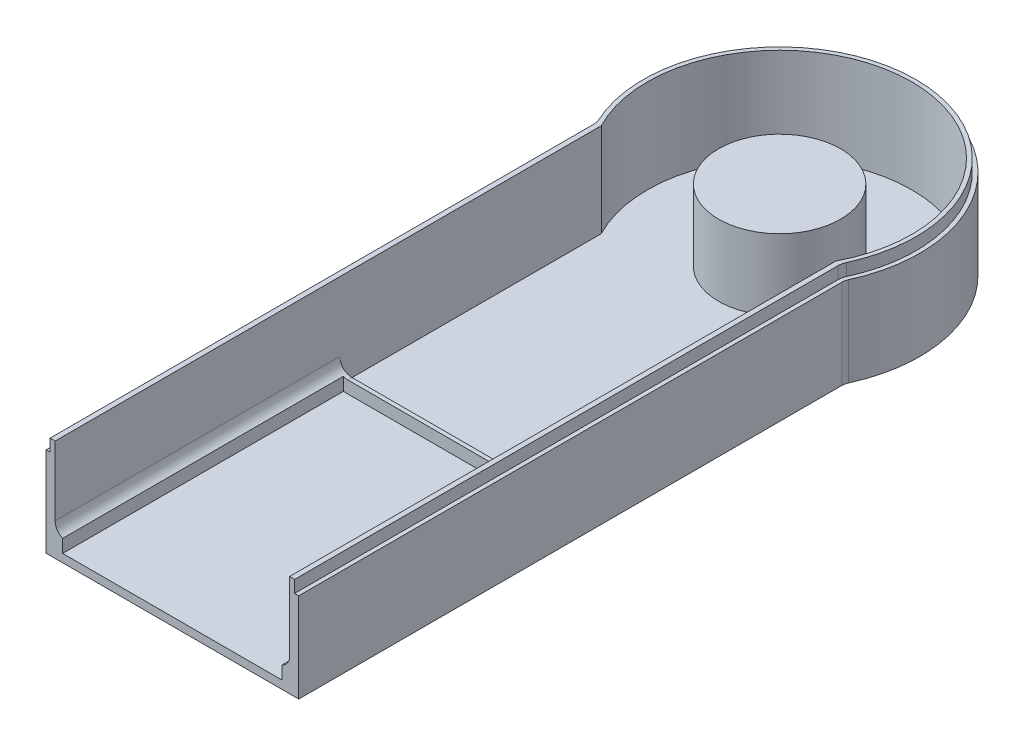
ISO-10303-21;
HEADER;
FILE_DESCRIPTION(('STEP AP214'),'2;1');
FILE_NAME('part.step','',(''),(''),'','','');
FILE_SCHEMA(('AUTOMOTIVE_DESIGN { 1 0 10303 214 1 1 1 1 }'));
ENDSEC;
DATA;
#1=APPLICATION_CONTEXT('core data for automotive mechanical design processes');
#2=APPLICATION_PROTOCOL_DEFINITION('international standard','automotive_design',2000,#1);
#3=PRODUCT_CONTEXT('',#1,'mechanical');
#4=PRODUCT('Part','Part','',(#3));
#5=PRODUCT_RELATED_PRODUCT_CATEGORY('part','',(#4));
#6=PRODUCT_DEFINITION_FORMATION('','',#4);
#7=PRODUCT_DEFINITION_CONTEXT('part definition',#1,'design');
#8=PRODUCT_DEFINITION('design','',#6,#7);
#9=PRODUCT_DEFINITION_SHAPE('','',#8);
#10=(LENGTH_UNIT() NAMED_UNIT(*) SI_UNIT(.MILLI.,.METRE.));
#11=(NAMED_UNIT(*) PLANE_ANGLE_UNIT() SI_UNIT($,.RADIAN.));
#12=(NAMED_UNIT(*) SI_UNIT($,.STERADIAN.) SOLID_ANGLE_UNIT());
#13=UNCERTAINTY_MEASURE_WITH_UNIT(LENGTH_MEASURE(1.E-05),#10,'distance_accuracy_value','');
#14=(GEOMETRIC_REPRESENTATION_CONTEXT(3) GLOBAL_UNCERTAINTY_ASSIGNED_CONTEXT((#13)) GLOBAL_UNIT_ASSIGNED_CONTEXT((#10,
#11,#12)) REPRESENTATION_CONTEXT('',''));
#15=CARTESIAN_POINT('',(0.,0.,0.));
#16=DIRECTION('',(0.,0.,1.));
#17=DIRECTION('',(1.,0.,0.));
#18=AXIS2_PLACEMENT_3D('',#15,#16,#17);
#19=CARTESIAN_POINT('',(0.,0.,0.));
#20=DIRECTION('',(0.,1.,0.));
#21=DIRECTION('',(-1.,0.,0.));
#22=AXIS2_PLACEMENT_3D('',#19,#20,#21);
#23=CYLINDRICAL_SURFACE('',#22,34.5);
#24=DIRECTION('',(0.,1.,0.));
#25=VECTOR('',#24,1.);
#26=CARTESIAN_POINT('',(-31.342994944547,0.,14.4175819021811));
#27=LINE('',#26,#25);
#28=CARTESIAN_POINT('',(-31.342994944547,-47.,14.4175819021811));
#29=VERTEX_POINT('',#28);
#30=CARTESIAN_POINT('',(-31.342994944547,-25.,14.4175819021811));
#31=VERTEX_POINT('',#30);
#32=EDGE_CURVE('E219',#29,#31,#27,.T.);
#33=ORIENTED_EDGE('',*,*,#32,.T.);
#34=CARTESIAN_POINT('',(0.,-25.,0.));
#35=DIRECTION('',(0.,1.,0.));
#36=DIRECTION('',(0.,0.,1.));
#37=AXIS2_PLACEMENT_3D('',#34,#35,#36);
#38=CIRCLE('',#37,34.5);
#39=CARTESIAN_POINT('',(31.342994944547,-25.,14.4175819021811));
#40=VERTEX_POINT('',#39);
#41=EDGE_CURVE('E203',#40,#31,#38,.T.);
#42=ORIENTED_EDGE('',*,*,#41,.F.);
#43=DIRECTION('',(0.,1.,0.));
#44=VECTOR('',#43,1.);
#45=CARTESIAN_POINT('',(31.342994944547,0.,14.4175819021811));
#46=LINE('',#45,#44);
#47=CARTESIAN_POINT('',(31.342994944547,-47.,14.4175819021811));
#48=VERTEX_POINT('',#47);
#49=EDGE_CURVE('E216',#40,#48,#46,.F.);
#50=ORIENTED_EDGE('',*,*,#49,.T.);
#51=CARTESIAN_POINT('',(0.,-47.,0.));
#52=DIRECTION('',(0.,1.,0.));
#53=DIRECTION('',(-1.,0.,0.));
#54=AXIS2_PLACEMENT_3D('',#51,#52,#53);
#55=CIRCLE('',#54,34.5);
#56=EDGE_CURVE('E225',#48,#29,#55,.T.);
#57=ORIENTED_EDGE('',*,*,#56,.T.);
#58=EDGE_LOOP('',(#33,#42,#50,#57));
#59=FACE_BOUND('',#58,.T.);
#60=ADVANCED_FACE('F39',(#59),#23,.T.);
#61=CARTESIAN_POINT('',(-31.068472765812,0.,149.3));
#62=DIRECTION('',(1.,0.,0.));
#63=DIRECTION('',(0.,1.,0.));
#64=AXIS2_PLACEMENT_3D('',#61,#62,#63);
#65=PLANE('',#64);
#66=DIRECTION('',(0.,0.,1.));
#67=VECTOR('',#66,1.);
#68=CARTESIAN_POINT('',(-31.068472765812,-25.,15.6712846762838));
#69=LINE('',#68,#67);
#70=CARTESIAN_POINT('',(-31.068472765812,-25.,15.6712846762838));
#71=VERTEX_POINT('',#70);
#72=CARTESIAN_POINT('',(-31.068472765812,-25.,149.3));
#73=VERTEX_POINT('',#72);
#74=EDGE_CURVE('E653',#71,#73,#69,.T.);
#75=ORIENTED_EDGE('',*,*,#74,.F.);
#76=DIRECTION('',(0.,1.,0.));
#77=VECTOR('',#76,1.);
#78=CARTESIAN_POINT('',(-31.068472765812,0.,15.6712846762838));
#79=LINE('',#78,#77);
#80=CARTESIAN_POINT('',(-31.068472765812,-47.,15.6712846762838));
#81=VERTEX_POINT('',#80);
#82=EDGE_CURVE('E227',#71,#81,#79,.F.);
#83=ORIENTED_EDGE('',*,*,#82,.T.);
#84=DIRECTION('',(0.,0.,-1.));
#85=VECTOR('',#84,1.);
#86=CARTESIAN_POINT('',(-31.068472765812,-47.,149.3));
#87=LINE('',#86,#85);
#88=CARTESIAN_POINT('',(-31.068472765812,-47.,149.3));
#89=VERTEX_POINT('',#88);
#90=EDGE_CURVE('E345',#89,#81,#87,.T.);
#91=ORIENTED_EDGE('',*,*,#90,.F.);
#92=DIRECTION('',(0.,-1.,0.));
#93=VECTOR('',#92,1.);
#94=CARTESIAN_POINT('',(-31.068472765812,0.,149.3));
#95=LINE('',#94,#93);
#96=EDGE_CURVE('E286',#73,#89,#95,.T.);
#97=ORIENTED_EDGE('',*,*,#96,.F.);
#98=EDGE_LOOP('',(#75,#83,#91,#97));
#99=FACE_BOUND('',#98,.T.);
#100=ADVANCED_FACE('F378',(#99),#65,.F.);
#101=CARTESIAN_POINT('',(31.068472765812,0.,149.3));
#102=DIRECTION('',(1.,0.,0.));
#103=DIRECTION('',(0.,1.,0.));
#104=AXIS2_PLACEMENT_3D('',#101,#102,#103);
#105=PLANE('',#104);
#106=DIRECTION('',(0.,-1.,0.));
#107=VECTOR('',#106,1.);
#108=CARTESIAN_POINT('',(31.068472765812,0.,15.6712846762838));
#109=LINE('',#108,#107);
#110=CARTESIAN_POINT('',(31.068472765812,-47.,15.6712846762838));
#111=VERTEX_POINT('',#110);
#112=CARTESIAN_POINT('',(31.068472765812,-25.,15.6712846762838));
#113=VERTEX_POINT('',#112);
#114=EDGE_CURVE('E234',#111,#113,#109,.F.);
#115=ORIENTED_EDGE('',*,*,#114,.T.);
#116=DIRECTION('',(0.,0.,-1.));
#117=VECTOR('',#116,1.);
#118=CARTESIAN_POINT('',(31.068472765812,-25.,15.6712846762838));
#119=LINE('',#118,#117);
#120=CARTESIAN_POINT('',(31.068472765812,-25.,149.3));
#121=VERTEX_POINT('',#120);
#122=EDGE_CURVE('E206',#121,#113,#119,.T.);
#123=ORIENTED_EDGE('',*,*,#122,.F.);
#124=DIRECTION('',(0.,-1.,0.));
#125=VECTOR('',#124,1.);
#126=CARTESIAN_POINT('',(31.068472765812,0.,149.3));
#127=LINE('',#126,#125);
#128=CARTESIAN_POINT('',(31.068472765812,-47.,149.3));
#129=VERTEX_POINT('',#128);
#130=EDGE_CURVE('E339',#121,#129,#127,.T.);
#131=ORIENTED_EDGE('',*,*,#130,.T.);
#132=DIRECTION('',(0.,0.,-1.));
#133=VECTOR('',#132,1.);
#134=CARTESIAN_POINT('',(31.068472765812,-47.,149.3));
#135=LINE('',#134,#133);
#136=EDGE_CURVE('E342',#129,#111,#135,.T.);
#137=ORIENTED_EDGE('',*,*,#136,.T.);
#138=EDGE_LOOP('',(#115,#123,#131,#137));
#139=FACE_BOUND('',#138,.T.);
#140=ADVANCED_FACE('F384',(#139),#105,.T.);
#141=CARTESIAN_POINT('',(-34.068472765812,0.,15.6712846762838));
#142=DIRECTION('',(0.,1.,0.));
#143=DIRECTION('',(-1.,0.,0.));
#144=AXIS2_PLACEMENT_3D('',#141,#142,#143);
#145=CYLINDRICAL_SURFACE('',#144,3.);
#146=CARTESIAN_POINT('',(-34.068472765812,-25.,15.6712846762838));
#147=DIRECTION('',(0.,-1.,0.));
#148=DIRECTION('',(0.,0.,1.));
#149=AXIS2_PLACEMENT_3D('',#146,#147,#148);
#150=CIRCLE('',#149,3.);
#151=EDGE_CURVE('E220',#31,#71,#150,.T.);
#152=ORIENTED_EDGE('',*,*,#151,.F.);
#153=ORIENTED_EDGE('',*,*,#32,.F.);
#154=CARTESIAN_POINT('',(-34.068472765812,-47.,15.6712846762838));
#155=DIRECTION('',(0.,-1.,0.));
#156=DIRECTION('',(1.,0.,0.));
#157=AXIS2_PLACEMENT_3D('',#154,#155,#156);
#158=CIRCLE('',#157,3.);
#159=EDGE_CURVE('E236',#81,#29,#158,.F.);
#160=ORIENTED_EDGE('',*,*,#159,.F.);
#161=ORIENTED_EDGE('',*,*,#82,.F.);
#162=EDGE_LOOP('',(#152,#153,#160,#161));
#163=FACE_BOUND('',#162,.T.);
#164=ADVANCED_FACE('F392',(#163),#145,.F.);
#165=CARTESIAN_POINT('',(34.068472765812,0.,15.6712846762838));
#166=DIRECTION('',(0.,1.,0.));
#167=DIRECTION('',(-1.,0.,0.));
#168=AXIS2_PLACEMENT_3D('',#165,#166,#167);
#169=CYLINDRICAL_SURFACE('',#168,3.);
#170=CARTESIAN_POINT('',(34.068472765812,-25.,15.6712846762838));
#171=DIRECTION('',(0.,-1.,0.));
#172=DIRECTION('',(0.,0.,1.));
#173=AXIS2_PLACEMENT_3D('',#170,#171,#172);
#174=CIRCLE('',#173,3.);
#175=EDGE_CURVE('E200',#113,#40,#174,.T.);
#176=ORIENTED_EDGE('',*,*,#175,.F.);
#177=ORIENTED_EDGE('',*,*,#114,.F.);
#178=CARTESIAN_POINT('',(34.068472765812,-47.,15.6712846762838));
#179=DIRECTION('',(0.,-1.,0.));
#180=DIRECTION('',(1.,0.,0.));
#181=AXIS2_PLACEMENT_3D('',#178,#179,#180);
#182=CIRCLE('',#181,3.);
#183=EDGE_CURVE('E224',#48,#111,#182,.F.);
#184=ORIENTED_EDGE('',*,*,#183,.F.);
#185=ORIENTED_EDGE('',*,*,#49,.F.);
#186=EDGE_LOOP('',(#176,#177,#184,#185));
#187=FACE_BOUND('',#186,.T.);
#188=ADVANCED_FACE('F223',(#187),#169,.F.);
#189=CARTESIAN_POINT('',(28.831406486677,0.,149.3));
#190=DIRECTION('',(1.,0.,0.));
#191=DIRECTION('',(0.,1.,0.));
#192=AXIS2_PLACEMENT_3D('',#189,#190,#191);
#193=PLANE('',#192);
#194=DIRECTION('',(0.,0.,1.));
#195=VECTOR('',#194,1.);
#196=CARTESIAN_POINT('',(28.831406486677,-22.,149.3));
#197=LINE('',#196,#195);
#198=CARTESIAN_POINT('',(28.831406486677,-22.,15.));
#199=VERTEX_POINT('',#198);
#200=CARTESIAN_POINT('',(28.831406486677,-22.,149.3));
#201=VERTEX_POINT('',#200);
#202=EDGE_CURVE('E702',#199,#201,#197,.T.);
#203=ORIENTED_EDGE('',*,*,#202,.F.);
#204=DIRECTION('',(0.,1.,0.));
#205=VECTOR('',#204,1.);
#206=CARTESIAN_POINT('',(28.831406486677,-45.,15.));
#207=LINE('',#206,#205);
#208=CARTESIAN_POINT('',(28.831406486677,-45.,15.));
#209=VERTEX_POINT('',#208);
#210=EDGE_CURVE('E327',#209,#199,#207,.T.);
#211=ORIENTED_EDGE('',*,*,#210,.F.);
#212=DIRECTION('',(0.,0.,-1.));
#213=VECTOR('',#212,1.);
#214=CARTESIAN_POINT('',(28.831406486677,-45.,149.3));
#215=LINE('',#214,#213);
#216=CARTESIAN_POINT('',(28.831406486677,-45.,79.3));
#217=VERTEX_POINT('',#216);
#218=EDGE_CURVE('E346',#217,#209,#215,.T.);
#219=ORIENTED_EDGE('',*,*,#218,.F.);
#220=DIRECTION('',(0.,-1.,0.));
#221=VECTOR('',#220,1.);
#222=CARTESIAN_POINT('',(28.831406486677,-42.,79.3));
#223=LINE('',#222,#221);
#224=CARTESIAN_POINT('',(28.831406486677,-39.,79.3));
#225=VERTEX_POINT('',#224);
#226=EDGE_CURVE('E303',#225,#217,#223,.T.);
#227=ORIENTED_EDGE('',*,*,#226,.F.);
#228=DIRECTION('',(0.,0.,-1.));
#229=VECTOR('',#228,1.);
#230=CARTESIAN_POINT('',(28.831406486677,-39.,149.3));
#231=LINE('',#230,#229);
#232=CARTESIAN_POINT('',(28.831406486677,-39.,149.3));
#233=VERTEX_POINT('',#232);
#234=EDGE_CURVE('E245',#225,#233,#231,.F.);
#235=ORIENTED_EDGE('',*,*,#234,.T.);
#236=DIRECTION('',(0.,-1.,0.));
#237=VECTOR('',#236,1.);
#238=CARTESIAN_POINT('',(28.831406486677,0.,149.3));
#239=LINE('',#238,#237);
#240=EDGE_CURVE('E332',#201,#233,#239,.T.);
#241=ORIENTED_EDGE('',*,*,#240,.F.);
#242=EDGE_LOOP('',(#203,#211,#219,#227,#235,#241));
#243=FACE_BOUND('',#242,.T.);
#244=ADVANCED_FACE('F391',(#243),#193,.F.);
#245=CARTESIAN_POINT('',(-28.831406486677,0.,149.3));
#246=DIRECTION('',(-1.,0.,0.));
#247=DIRECTION('',(0.,0.,1.));
#248=AXIS2_PLACEMENT_3D('',#245,#246,#247);
#249=PLANE('',#248);
#250=DIRECTION('',(0.,0.,-1.));
#251=VECTOR('',#250,1.);
#252=CARTESIAN_POINT('',(-28.831406486677,-22.,149.3));
#253=LINE('',#252,#251);
#254=CARTESIAN_POINT('',(-28.831406486677,-22.,149.3));
#255=VERTEX_POINT('',#254);
#256=CARTESIAN_POINT('',(-28.831406486677,-22.,15.));
#257=VERTEX_POINT('',#256);
#258=EDGE_CURVE('E285',#255,#257,#253,.T.);
#259=ORIENTED_EDGE('',*,*,#258,.F.);
#260=DIRECTION('',(0.,1.,0.));
#261=VECTOR('',#260,1.);
#262=CARTESIAN_POINT('',(-28.831406486677,0.,149.3));
#263=LINE('',#262,#261);
#264=CARTESIAN_POINT('',(-28.831406486677,-39.,149.3));
#265=VERTEX_POINT('',#264);
#266=EDGE_CURVE('E272',#265,#255,#263,.T.);
#267=ORIENTED_EDGE('',*,*,#266,.F.);
#268=DIRECTION('',(0.,0.,1.));
#269=VECTOR('',#268,1.);
#270=CARTESIAN_POINT('',(-28.831406486677,-39.,149.3));
#271=LINE('',#270,#269);
#272=CARTESIAN_POINT('',(-28.831406486677,-39.,79.3));
#273=VERTEX_POINT('',#272);
#274=EDGE_CURVE('E248',#265,#273,#271,.F.);
#275=ORIENTED_EDGE('',*,*,#274,.T.);
#276=DIRECTION('',(0.,-1.,0.));
#277=VECTOR('',#276,1.);
#278=CARTESIAN_POINT('',(-28.831406486677,-42.,79.3));
#279=LINE('',#278,#277);
#280=CARTESIAN_POINT('',(-28.831406486677,-45.,79.3));
#281=VERTEX_POINT('',#280);
#282=EDGE_CURVE('E295',#273,#281,#279,.T.);
#283=ORIENTED_EDGE('',*,*,#282,.T.);
#284=DIRECTION('',(0.,0.,-1.));
#285=VECTOR('',#284,1.);
#286=CARTESIAN_POINT('',(-28.831406486677,-45.,149.3));
#287=LINE('',#286,#285);
#288=CARTESIAN_POINT('',(-28.831406486677,-45.,15.));
#289=VERTEX_POINT('',#288);
#290=EDGE_CURVE('E341',#281,#289,#287,.T.);
#291=ORIENTED_EDGE('',*,*,#290,.T.);
#292=DIRECTION('',(0.,-1.,0.));
#293=VECTOR('',#292,1.);
#294=CARTESIAN_POINT('',(-28.831406486677,-5.,15.));
#295=LINE('',#294,#293);
#296=EDGE_CURVE('E330',#257,#289,#295,.T.);
#297=ORIENTED_EDGE('',*,*,#296,.F.);
#298=EDGE_LOOP('',(#259,#267,#275,#283,#291,#297));
#299=FACE_BOUND('',#298,.T.);
#300=ADVANCED_FACE('F280',(#299),#249,.F.);
#301=CARTESIAN_POINT('',(0.,0.,149.3));
#302=DIRECTION('',(0.,0.,1.));
#303=DIRECTION('',(1.,0.,0.));
#304=AXIS2_PLACEMENT_3D('',#301,#302,#303);
#305=PLANE('',#304);
#306=DIRECTION('',(0.,1.,0.));
#307=VECTOR('',#306,1.);
#308=CARTESIAN_POINT('',(30.068472765812,-25.,149.3));
#309=LINE('',#308,#307);
#310=CARTESIAN_POINT('',(30.068472765812,-25.,149.3));
#311=VERTEX_POINT('',#310);
#312=CARTESIAN_POINT('',(30.068472765812,-22.,149.3));
#313=VERTEX_POINT('',#312);
#314=EDGE_CURVE('E690',#311,#313,#309,.T.);
#315=ORIENTED_EDGE('',*,*,#314,.T.);
#316=DIRECTION('',(-1.,0.,0.));
#317=VECTOR('',#316,1.);
#318=CARTESIAN_POINT('',(0.,-22.,149.3));
#319=LINE('',#318,#317);
#320=EDGE_CURVE('E62',#313,#201,#319,.T.);
#321=ORIENTED_EDGE('',*,*,#320,.T.);
#322=ORIENTED_EDGE('',*,*,#240,.T.);
#323=CARTESIAN_POINT('',(25.831406486677,-39.,149.3));
#324=DIRECTION('',(0.,0.,1.));
#325=DIRECTION('',(1.,0.,0.));
#326=AXIS2_PLACEMENT_3D('',#323,#324,#325);
#327=CIRCLE('',#326,3.);
#328=CARTESIAN_POINT('',(26.961406486677,-41.7790465991055,149.3));
#329=VERTEX_POINT('',#328);
#330=EDGE_CURVE('E254',#233,#329,#327,.F.);
#331=ORIENTED_EDGE('',*,*,#330,.T.);
#332=DIRECTION('',(0.,-1.,0.));
#333=VECTOR('',#332,1.);
#334=CARTESIAN_POINT('',(26.961406486677,-42.,149.3));
#335=LINE('',#334,#333);
#336=CARTESIAN_POINT('',(26.961406486677,-45.,149.3));
#337=VERTEX_POINT('',#336);
#338=EDGE_CURVE('E317',#329,#337,#335,.T.);
#339=ORIENTED_EDGE('',*,*,#338,.T.);
#340=DIRECTION('',(-1.,0.,0.));
#341=VECTOR('',#340,1.);
#342=CARTESIAN_POINT('',(0.,-45.,149.3));
#343=LINE('',#342,#341);
#344=CARTESIAN_POINT('',(-26.961406486677,-45.,149.3));
#345=VERTEX_POINT('',#344);
#346=EDGE_CURVE('E287',#337,#345,#343,.T.);
#347=ORIENTED_EDGE('',*,*,#346,.T.);
#348=DIRECTION('',(0.,-1.,0.));
#349=VECTOR('',#348,1.);
#350=CARTESIAN_POINT('',(-26.961406486677,-42.,149.3));
#351=LINE('',#350,#349);
#352=CARTESIAN_POINT('',(-26.961406486677,-41.7790465991055,149.3));
#353=VERTEX_POINT('',#352);
#354=EDGE_CURVE('E275',#353,#345,#351,.T.);
#355=ORIENTED_EDGE('',*,*,#354,.F.);
#356=CARTESIAN_POINT('',(-25.831406486677,-39.,149.3));
#357=DIRECTION('',(0.,0.,1.));
#358=DIRECTION('',(1.,0.,0.));
#359=AXIS2_PLACEMENT_3D('',#356,#357,#358);
#360=CIRCLE('',#359,3.);
#361=EDGE_CURVE('E47',#353,#265,#360,.F.);
#362=ORIENTED_EDGE('',*,*,#361,.T.);
#363=ORIENTED_EDGE('',*,*,#266,.T.);
#364=CARTESIAN_POINT('',(-30.0684727658119,-22.,149.3));
#365=VERTEX_POINT('',#364);
#366=EDGE_CURVE('E703',#255,#365,#319,.T.);
#367=ORIENTED_EDGE('',*,*,#366,.T.);
#368=DIRECTION('',(0.,1.,0.));
#369=VECTOR('',#368,1.);
#370=CARTESIAN_POINT('',(-30.068472765812,-25.,149.3));
#371=LINE('',#370,#369);
#372=CARTESIAN_POINT('',(-30.068472765812,-25.,149.3));
#373=VERTEX_POINT('',#372);
#374=EDGE_CURVE('E54',#373,#365,#371,.T.);
#375=ORIENTED_EDGE('',*,*,#374,.F.);
#376=DIRECTION('',(1.,0.,0.));
#377=VECTOR('',#376,1.);
#378=CARTESIAN_POINT('',(-31.068472765812,-25.,149.3));
#379=LINE('',#378,#377);
#380=EDGE_CURVE('E655',#73,#373,#379,.T.);
#381=ORIENTED_EDGE('',*,*,#380,.F.);
#382=ORIENTED_EDGE('',*,*,#96,.T.);
#383=DIRECTION('',(1.,0.,0.));
#384=VECTOR('',#383,1.);
#385=CARTESIAN_POINT('',(0.,-47.,149.3));
#386=LINE('',#385,#384);
#387=EDGE_CURVE('E336',#89,#129,#386,.T.);
#388=ORIENTED_EDGE('',*,*,#387,.T.);
#389=ORIENTED_EDGE('',*,*,#130,.F.);
#390=DIRECTION('',(1.,0.,0.));
#391=VECTOR('',#390,1.);
#392=CARTESIAN_POINT('',(30.068472765812,-25.,149.3));
#393=LINE('',#392,#391);
#394=EDGE_CURVE('E675',#311,#121,#393,.T.);
#395=ORIENTED_EDGE('',*,*,#394,.F.);
#396=EDGE_LOOP('',(#315,#321,#322,#331,#339,#347,#355,#362,#363,#367,#375,#381,#382,#388,#389,#395));
#397=FACE_BOUND('',#396,.T.);
#398=ADVANCED_FACE('F270',(#397),#305,.T.);
#399=CARTESIAN_POINT('',(0.,0.,0.));
#400=DIRECTION('',(0.,1.,0.));
#401=DIRECTION('',(-1.,0.,0.));
#402=AXIS2_PLACEMENT_3D('',#399,#400,#401);
#403=CYLINDRICAL_SURFACE('',#402,32.5);
#404=ORIENTED_EDGE('',*,*,#210,.T.);
#405=CARTESIAN_POINT('',(0.,-22.,0.));
#406=DIRECTION('',(0.,1.,0.));
#407=DIRECTION('',(0.,0.,1.));
#408=AXIS2_PLACEMENT_3D('',#405,#406,#407);
#409=CIRCLE('',#408,32.5);
#410=EDGE_CURVE('E705',#199,#257,#409,.T.);
#411=ORIENTED_EDGE('',*,*,#410,.T.);
#412=ORIENTED_EDGE('',*,*,#296,.T.);
#413=CARTESIAN_POINT('',(0.,-45.,0.));
#414=DIRECTION('',(0.,1.,0.));
#415=DIRECTION('',(-1.,0.,0.));
#416=AXIS2_PLACEMENT_3D('',#413,#414,#415);
#417=CIRCLE('',#416,32.5);
#418=EDGE_CURVE('E349',#209,#289,#417,.T.);
#419=ORIENTED_EDGE('',*,*,#418,.F.);
#420=EDGE_LOOP('',(#404,#411,#412,#419));
#421=FACE_BOUND('',#420,.T.);
#422=ADVANCED_FACE('F424',(#421),#403,.F.);
#423=CARTESIAN_POINT('',(-15.,-45.,0.));
#424=DIRECTION('',(0.,1.,0.));
#425=DIRECTION('',(-1.,0.,0.));
#426=AXIS2_PLACEMENT_3D('',#423,#424,#425);
#427=PLANE('',#426);
#428=DIRECTION('',(1.,0.,0.));
#429=VECTOR('',#428,1.);
#430=CARTESIAN_POINT('',(-26.961406486677,-45.,80.3));
#431=LINE('',#430,#429);
#432=CARTESIAN_POINT('',(-26.961406486677,-45.,80.3));
#433=VERTEX_POINT('',#432);
#434=CARTESIAN_POINT('',(26.961406486677,-45.,80.3));
#435=VERTEX_POINT('',#434);
#436=EDGE_CURVE('E311',#433,#435,#431,.T.);
#437=ORIENTED_EDGE('',*,*,#436,.F.);
#438=DIRECTION('',(0.,0.,-1.));
#439=VECTOR('',#438,1.);
#440=CARTESIAN_POINT('',(-26.961406486677,-45.,149.3));
#441=LINE('',#440,#439);
#442=EDGE_CURVE('E309',#345,#433,#441,.T.);
#443=ORIENTED_EDGE('',*,*,#442,.F.);
#444=ORIENTED_EDGE('',*,*,#346,.F.);
#445=DIRECTION('',(0.,0.,1.));
#446=VECTOR('',#445,1.);
#447=CARTESIAN_POINT('',(26.961406486677,-45.,80.3));
#448=LINE('',#447,#446);
#449=EDGE_CURVE('E313',#435,#337,#448,.T.);
#450=ORIENTED_EDGE('',*,*,#449,.F.);
#451=EDGE_LOOP('',(#437,#443,#444,#450));
#452=FACE_BOUND('',#451,.T.);
#453=ADVANCED_FACE('F420',(#452),#427,.T.);
#454=CARTESIAN_POINT('',(0.,-45.,0.));
#455=DIRECTION('',(0.,1.,0.));
#456=DIRECTION('',(-1.,0.,0.));
#457=AXIS2_PLACEMENT_3D('',#454,#455,#456);
#458=CIRCLE('',#457,15.);
#459=CARTESIAN_POINT('',(-15.,-45.,0.));
#460=VERTEX_POINT('',#459);
#461=EDGE_CURVE('E355',#460,#460,#458,.T.);
#462=ORIENTED_EDGE('',*,*,#461,.F.);
#463=EDGE_LOOP('',(#462));
#464=FACE_BOUND('',#463,.T.);
#465=ORIENTED_EDGE('',*,*,#290,.F.);
#466=DIRECTION('',(-1.,0.,0.));
#467=VECTOR('',#466,1.);
#468=CARTESIAN_POINT('',(28.831406486677,-45.,79.3));
#469=LINE('',#468,#467);
#470=EDGE_CURVE('E305',#217,#281,#469,.T.);
#471=ORIENTED_EDGE('',*,*,#470,.F.);
#472=ORIENTED_EDGE('',*,*,#218,.T.);
#473=ORIENTED_EDGE('',*,*,#418,.T.);
#474=EDGE_LOOP('',(#465,#471,#472,#473));
#475=FACE_BOUND('',#474,.T.);
#476=ADVANCED_FACE('F423',(#464,#475),#427,.T.);
#477=CARTESIAN_POINT('',(-34.5,-47.,0.));
#478=DIRECTION('',(0.,-1.,0.));
#479=DIRECTION('',(1.,0.,0.));
#480=AXIS2_PLACEMENT_3D('',#477,#478,#479);
#481=PLANE('',#480);
#482=ORIENTED_EDGE('',*,*,#56,.F.);
#483=ORIENTED_EDGE('',*,*,#183,.T.);
#484=ORIENTED_EDGE('',*,*,#136,.F.);
#485=ORIENTED_EDGE('',*,*,#387,.F.);
#486=ORIENTED_EDGE('',*,*,#90,.T.);
#487=ORIENTED_EDGE('',*,*,#159,.T.);
#488=EDGE_LOOP('',(#482,#483,#484,#485,#486,#487));
#489=FACE_BOUND('',#488,.T.);
#490=ADVANCED_FACE('F374',(#489),#481,.T.);
#491=CARTESIAN_POINT('',(0.,-27.5,0.));
#492=DIRECTION('',(0.,1.,0.));
#493=DIRECTION('',(-1.,0.,0.));
#494=AXIS2_PLACEMENT_3D('',#491,#492,#493);
#495=PLANE('',#494);
#496=CARTESIAN_POINT('',(0.,-27.5,0.));
#497=DIRECTION('',(0.,1.,0.));
#498=DIRECTION('',(-1.,0.,0.));
#499=AXIS2_PLACEMENT_3D('',#496,#497,#498);
#500=CIRCLE('',#499,15.);
#501=CARTESIAN_POINT('',(-15.,-27.5,0.));
#502=VERTEX_POINT('',#501);
#503=EDGE_CURVE('E229',#502,#502,#500,.T.);
#504=ORIENTED_EDGE('',*,*,#503,.T.);
#505=EDGE_LOOP('',(#504));
#506=FACE_BOUND('',#505,.T.);
#507=ADVANCED_FACE('F360',(#506),#495,.T.);
#508=CARTESIAN_POINT('',(0.,0.,0.));
#509=DIRECTION('',(0.,1.,0.));
#510=DIRECTION('',(-1.,0.,0.));
#511=AXIS2_PLACEMENT_3D('',#508,#509,#510);
#512=CYLINDRICAL_SURFACE('',#511,15.);
#513=ORIENTED_EDGE('',*,*,#461,.T.);
#514=EDGE_LOOP('',(#513));
#515=FACE_BOUND('',#514,.T.);
#516=ORIENTED_EDGE('',*,*,#503,.F.);
#517=EDGE_LOOP('',(#516));
#518=FACE_BOUND('',#517,.T.);
#519=ADVANCED_FACE('F362',(#515,#518),#512,.T.);
#520=CARTESIAN_POINT('',(-26.961406486677,-42.,149.3));
#521=DIRECTION('',(-1.,0.,0.));
#522=DIRECTION('',(0.,-1.,0.));
#523=AXIS2_PLACEMENT_3D('',#520,#521,#522);
#524=PLANE('',#523);
#525=ORIENTED_EDGE('',*,*,#442,.T.);
#526=DIRECTION('',(0.,-1.,0.));
#527=VECTOR('',#526,1.);
#528=CARTESIAN_POINT('',(-26.961406486677,-42.,80.3));
#529=LINE('',#528,#527);
#530=CARTESIAN_POINT('',(-26.961406486677,-41.7790465991055,80.3));
#531=VERTEX_POINT('',#530);
#532=EDGE_CURVE('E323',#531,#433,#529,.T.);
#533=ORIENTED_EDGE('',*,*,#532,.F.);
#534=DIRECTION('',(0.,0.,1.));
#535=VECTOR('',#534,1.);
#536=CARTESIAN_POINT('',(-26.961406486677,-41.7790465991055,80.3));
#537=LINE('',#536,#535);
#538=EDGE_CURVE('E265',#531,#353,#537,.T.);
#539=ORIENTED_EDGE('',*,*,#538,.T.);
#540=ORIENTED_EDGE('',*,*,#354,.T.);
#541=EDGE_LOOP('',(#525,#533,#539,#540));
#542=FACE_BOUND('',#541,.T.);
#543=ADVANCED_FACE('F364',(#542),#524,.F.);
#544=CARTESIAN_POINT('',(-26.961406486677,-42.,80.3));
#545=DIRECTION('',(0.,0.,-1.));
#546=DIRECTION('',(-1.,0.,0.));
#547=AXIS2_PLACEMENT_3D('',#544,#545,#546);
#548=PLANE('',#547);
#549=ORIENTED_EDGE('',*,*,#436,.T.);
#550=DIRECTION('',(0.,-1.,0.));
#551=VECTOR('',#550,1.);
#552=CARTESIAN_POINT('',(26.961406486677,-42.,80.3));
#553=LINE('',#552,#551);
#554=CARTESIAN_POINT('',(26.961406486677,-41.7790465991055,80.3));
#555=VERTEX_POINT('',#554);
#556=EDGE_CURVE('E320',#555,#435,#553,.T.);
#557=ORIENTED_EDGE('',*,*,#556,.F.);
#558=CARTESIAN_POINT('',(25.831406486677,-39.,80.3));
#559=DIRECTION('',(0.,0.,-1.));
#560=DIRECTION('',(-1.,0.,0.));
#561=AXIS2_PLACEMENT_3D('',#558,#559,#560);
#562=CIRCLE('',#561,3.);
#563=CARTESIAN_POINT('',(25.831406486677,-42.,80.3));
#564=VERTEX_POINT('',#563);
#565=EDGE_CURVE('E260',#555,#564,#562,.T.);
#566=ORIENTED_EDGE('',*,*,#565,.T.);
#567=DIRECTION('',(1.,0.,0.));
#568=VECTOR('',#567,1.);
#569=CARTESIAN_POINT('',(-26.961406486677,-42.,80.3));
#570=LINE('',#569,#568);
#571=CARTESIAN_POINT('',(-25.831406486677,-42.,80.3));
#572=VERTEX_POINT('',#571);
#573=EDGE_CURVE('E301',#572,#564,#570,.T.);
#574=ORIENTED_EDGE('',*,*,#573,.F.);
#575=CARTESIAN_POINT('',(-25.831406486677,-39.,80.3));
#576=DIRECTION('',(0.,0.,-1.));
#577=DIRECTION('',(-1.,0.,0.));
#578=AXIS2_PLACEMENT_3D('',#575,#576,#577);
#579=CIRCLE('',#578,3.);
#580=EDGE_CURVE('E262',#572,#531,#579,.T.);
#581=ORIENTED_EDGE('',*,*,#580,.T.);
#582=ORIENTED_EDGE('',*,*,#532,.T.);
#583=EDGE_LOOP('',(#549,#557,#566,#574,#581,#582));
#584=FACE_BOUND('',#583,.T.);
#585=ADVANCED_FACE('F371',(#584),#548,.F.);
#586=CARTESIAN_POINT('',(26.961406486677,-42.,80.3));
#587=DIRECTION('',(1.,0.,0.));
#588=DIRECTION('',(0.,1.,0.));
#589=AXIS2_PLACEMENT_3D('',#586,#587,#588);
#590=PLANE('',#589);
#591=ORIENTED_EDGE('',*,*,#449,.T.);
#592=ORIENTED_EDGE('',*,*,#338,.F.);
#593=DIRECTION('',(0.,0.,-1.));
#594=VECTOR('',#593,1.);
#595=CARTESIAN_POINT('',(26.961406486677,-41.7790465991055,149.3));
#596=LINE('',#595,#594);
#597=EDGE_CURVE('E257',#329,#555,#596,.T.);
#598=ORIENTED_EDGE('',*,*,#597,.T.);
#599=ORIENTED_EDGE('',*,*,#556,.T.);
#600=EDGE_LOOP('',(#591,#592,#598,#599));
#601=FACE_BOUND('',#600,.T.);
#602=ADVANCED_FACE('F418',(#601),#590,.F.);
#603=CARTESIAN_POINT('',(28.831406486677,-42.,79.3));
#604=DIRECTION('',(0.,0.,1.));
#605=DIRECTION('',(1.,0.,0.));
#606=AXIS2_PLACEMENT_3D('',#603,#604,#605);
#607=PLANE('',#606);
#608=ORIENTED_EDGE('',*,*,#470,.T.);
#609=ORIENTED_EDGE('',*,*,#282,.F.);
#610=CARTESIAN_POINT('',(-25.831406486677,-39.,79.3));
#611=DIRECTION('',(0.,0.,1.));
#612=DIRECTION('',(1.,0.,0.));
#613=AXIS2_PLACEMENT_3D('',#610,#611,#612);
#614=CIRCLE('',#613,3.);
#615=CARTESIAN_POINT('',(-25.831406486677,-42.,79.3));
#616=VERTEX_POINT('',#615);
#617=EDGE_CURVE('E11',#273,#616,#614,.T.);
#618=ORIENTED_EDGE('',*,*,#617,.T.);
#619=DIRECTION('',(-1.,0.,0.));
#620=VECTOR('',#619,1.);
#621=CARTESIAN_POINT('',(28.831406486677,-42.,79.3));
#622=LINE('',#621,#620);
#623=CARTESIAN_POINT('',(25.831406486677,-42.,79.3));
#624=VERTEX_POINT('',#623);
#625=EDGE_CURVE('E294',#624,#616,#622,.T.);
#626=ORIENTED_EDGE('',*,*,#625,.F.);
#627=CARTESIAN_POINT('',(25.831406486677,-39.,79.3));
#628=DIRECTION('',(0.,0.,1.));
#629=DIRECTION('',(1.,0.,0.));
#630=AXIS2_PLACEMENT_3D('',#627,#628,#629);
#631=CIRCLE('',#630,3.);
#632=EDGE_CURVE('E251',#624,#225,#631,.T.);
#633=ORIENTED_EDGE('',*,*,#632,.T.);
#634=ORIENTED_EDGE('',*,*,#226,.T.);
#635=EDGE_LOOP('',(#608,#609,#618,#626,#633,#634));
#636=FACE_BOUND('',#635,.T.);
#637=ADVANCED_FACE('F293',(#636),#607,.F.);
#638=CARTESIAN_POINT('',(0.,-42.,0.));
#639=DIRECTION('',(0.,1.,0.));
#640=DIRECTION('',(0.,0.,1.));
#641=AXIS2_PLACEMENT_3D('',#638,#639,#640);
#642=PLANE('',#641);
#643=ORIENTED_EDGE('',*,*,#573,.T.);
#644=DIRECTION('',(0.,0.,-1.));
#645=VECTOR('',#644,1.);
#646=CARTESIAN_POINT('',(25.831406486677,-42.,0.));
#647=LINE('',#646,#645);
#648=EDGE_CURVE('E242',#564,#624,#647,.T.);
#649=ORIENTED_EDGE('',*,*,#648,.T.);
#650=ORIENTED_EDGE('',*,*,#625,.T.);
#651=DIRECTION('',(0.,0.,1.));
#652=VECTOR('',#651,1.);
#653=CARTESIAN_POINT('',(-25.831406486677,-42.,0.));
#654=LINE('',#653,#652);
#655=EDGE_CURVE('E239',#616,#572,#654,.T.);
#656=ORIENTED_EDGE('',*,*,#655,.T.);
#657=EDGE_LOOP('',(#643,#649,#650,#656));
#658=FACE_BOUND('',#657,.T.);
#659=ADVANCED_FACE('F298',(#658),#642,.T.);
#660=CARTESIAN_POINT('',(25.831406486677,-39.,0.));
#661=DIRECTION('',(0.,0.,-1.));
#662=DIRECTION('',(-1.,0.,0.));
#663=AXIS2_PLACEMENT_3D('',#660,#661,#662);
#664=CYLINDRICAL_SURFACE('',#663,3.);
#665=ORIENTED_EDGE('',*,*,#330,.F.);
#666=ORIENTED_EDGE('',*,*,#234,.F.);
#667=ORIENTED_EDGE('',*,*,#632,.F.);
#668=ORIENTED_EDGE('',*,*,#648,.F.);
#669=ORIENTED_EDGE('',*,*,#565,.F.);
#670=ORIENTED_EDGE('',*,*,#597,.F.);
#671=EDGE_LOOP('',(#665,#666,#667,#668,#669,#670));
#672=FACE_BOUND('',#671,.T.);
#673=ADVANCED_FACE('F395',(#672),#664,.F.);
#674=CARTESIAN_POINT('',(-25.831406486677,-39.,0.));
#675=DIRECTION('',(0.,0.,1.));
#676=DIRECTION('',(1.,0.,0.));
#677=AXIS2_PLACEMENT_3D('',#674,#675,#676);
#678=CYLINDRICAL_SURFACE('',#677,3.);
#679=ORIENTED_EDGE('',*,*,#617,.F.);
#680=ORIENTED_EDGE('',*,*,#274,.F.);
#681=ORIENTED_EDGE('',*,*,#361,.F.);
#682=ORIENTED_EDGE('',*,*,#538,.F.);
#683=ORIENTED_EDGE('',*,*,#580,.F.);
#684=ORIENTED_EDGE('',*,*,#655,.F.);
#685=EDGE_LOOP('',(#679,#680,#681,#682,#683,#684));
#686=FACE_BOUND('',#685,.T.);
#687=ADVANCED_FACE('F41',(#686),#678,.F.);
#688=CARTESIAN_POINT('',(289.322206526514,-22.,181.782382923659));
#689=DIRECTION('',(0.,1.,0.));
#690=DIRECTION('',(0.,0.,1.));
#691=AXIS2_PLACEMENT_3D('',#688,#689,#690);
#692=PLANE('',#691);
#693=DIRECTION('',(0.,0.,1.));
#694=VECTOR('',#693,1.);
#695=CARTESIAN_POINT('',(30.068472765812,-22.,149.3));
#696=LINE('',#695,#694);
#697=CARTESIAN_POINT('',(30.068472765812,-22.,15.6712846762838));
#698=VERTEX_POINT('',#697);
#699=EDGE_CURVE('E211',#698,#313,#696,.T.);
#700=ORIENTED_EDGE('',*,*,#699,.F.);
#701=CARTESIAN_POINT('',(34.068472765812,-22.,15.6712846762838));
#702=DIRECTION('',(0.,1.,0.));
#703=DIRECTION('',(0.,0.,1.));
#704=AXIS2_PLACEMENT_3D('',#701,#702,#703);
#705=CIRCLE('',#704,4.);
#706=CARTESIAN_POINT('',(30.4345023374587,-22.,13.9996809774802));
#707=VERTEX_POINT('',#706);
#708=EDGE_CURVE('E686',#707,#698,#705,.T.);
#709=ORIENTED_EDGE('',*,*,#708,.F.);
#710=CARTESIAN_POINT('',(0.,-22.,0.));
#711=DIRECTION('',(0.,-1.,0.));
#712=DIRECTION('',(0.,0.,1.));
#713=AXIS2_PLACEMENT_3D('',#710,#711,#712);
#714=CIRCLE('',#713,33.5);
#715=CARTESIAN_POINT('',(-30.4345023374587,-22.,13.9996809774802));
#716=VERTEX_POINT('',#715);
#717=EDGE_CURVE('E683',#716,#707,#714,.T.);
#718=ORIENTED_EDGE('',*,*,#717,.F.);
#719=CARTESIAN_POINT('',(-34.068472765812,-22.,15.6712846762838));
#720=DIRECTION('',(0.,1.,0.));
#721=DIRECTION('',(0.,0.,1.));
#722=AXIS2_PLACEMENT_3D('',#719,#720,#721);
#723=CIRCLE('',#722,4.);
#724=CARTESIAN_POINT('',(-30.068472765812,-22.,15.6712846762838));
#725=VERTEX_POINT('',#724);
#726=EDGE_CURVE('E680',#725,#716,#723,.T.);
#727=ORIENTED_EDGE('',*,*,#726,.F.);
#728=DIRECTION('',(0.,0.,-1.));
#729=VECTOR('',#728,1.);
#730=CARTESIAN_POINT('',(-30.068472765812,-22.,15.6712846762838));
#731=LINE('',#730,#729);
#732=EDGE_CURVE('E678',#365,#725,#731,.T.);
#733=ORIENTED_EDGE('',*,*,#732,.F.);
#734=ORIENTED_EDGE('',*,*,#366,.F.);
#735=ORIENTED_EDGE('',*,*,#258,.T.);
#736=ORIENTED_EDGE('',*,*,#410,.F.);
#737=ORIENTED_EDGE('',*,*,#202,.T.);
#738=ORIENTED_EDGE('',*,*,#320,.F.);
#739=EDGE_LOOP('',(#700,#709,#718,#727,#733,#734,#735,#736,#737,#738));
#740=FACE_BOUND('',#739,.T.);
#741=ADVANCED_FACE('F402',(#740),#692,.T.);
#742=CARTESIAN_POINT('',(30.068472765812,-25.,149.3));
#743=DIRECTION('',(-1.,0.,0.));
#744=DIRECTION('',(0.,0.,1.));
#745=AXIS2_PLACEMENT_3D('',#742,#743,#744);
#746=PLANE('',#745);
#747=ORIENTED_EDGE('',*,*,#699,.T.);
#748=ORIENTED_EDGE('',*,*,#314,.F.);
#749=DIRECTION('',(0.,0.,1.));
#750=VECTOR('',#749,1.);
#751=CARTESIAN_POINT('',(30.068472765812,-25.,149.3));
#752=LINE('',#751,#750);
#753=CARTESIAN_POINT('',(30.068472765812,-25.,15.6712846762838));
#754=VERTEX_POINT('',#753);
#755=EDGE_CURVE('E672',#754,#311,#752,.T.);
#756=ORIENTED_EDGE('',*,*,#755,.F.);
#757=DIRECTION('',(0.,1.,0.));
#758=VECTOR('',#757,1.);
#759=CARTESIAN_POINT('',(30.068472765812,-25.,15.6712846762838));
#760=LINE('',#759,#758);
#761=EDGE_CURVE('E692',#754,#698,#760,.T.);
#762=ORIENTED_EDGE('',*,*,#761,.T.);
#763=EDGE_LOOP('',(#747,#748,#756,#762));
#764=FACE_BOUND('',#763,.T.);
#765=ADVANCED_FACE('F450',(#764),#746,.F.);
#766=CARTESIAN_POINT('',(34.068472765812,-25.,15.6712846762838));
#767=DIRECTION('',(0.,1.,0.));
#768=DIRECTION('',(0.,0.,1.));
#769=AXIS2_PLACEMENT_3D('',#766,#767,#768);
#770=CYLINDRICAL_SURFACE('',#769,4.);
#771=ORIENTED_EDGE('',*,*,#708,.T.);
#772=ORIENTED_EDGE('',*,*,#761,.F.);
#773=CARTESIAN_POINT('',(34.068472765812,-25.,15.6712846762838));
#774=DIRECTION('',(0.,1.,0.));
#775=DIRECTION('',(0.,0.,1.));
#776=AXIS2_PLACEMENT_3D('',#773,#774,#775);
#777=CIRCLE('',#776,4.);
#778=CARTESIAN_POINT('',(30.4345023374587,-25.,13.9996809774802));
#779=VERTEX_POINT('',#778);
#780=EDGE_CURVE('E669',#779,#754,#777,.T.);
#781=ORIENTED_EDGE('',*,*,#780,.F.);
#782=DIRECTION('',(0.,1.,0.));
#783=VECTOR('',#782,1.);
#784=CARTESIAN_POINT('',(30.4345023374587,-25.,13.9996809774802));
#785=LINE('',#784,#783);
#786=EDGE_CURVE('E694',#779,#707,#785,.T.);
#787=ORIENTED_EDGE('',*,*,#786,.T.);
#788=EDGE_LOOP('',(#771,#772,#781,#787));
#789=FACE_BOUND('',#788,.T.);
#790=ADVANCED_FACE('F462',(#789),#770,.F.);
#791=CARTESIAN_POINT('',(0.,-25.,0.));
#792=DIRECTION('',(0.,1.,0.));
#793=DIRECTION('',(0.,0.,1.));
#794=AXIS2_PLACEMENT_3D('',#791,#792,#793);
#795=CYLINDRICAL_SURFACE('',#794,33.5);
#796=ORIENTED_EDGE('',*,*,#717,.T.);
#797=ORIENTED_EDGE('',*,*,#786,.F.);
#798=CARTESIAN_POINT('',(0.,-25.,0.));
#799=DIRECTION('',(0.,-1.,0.));
#800=DIRECTION('',(0.,0.,1.));
#801=AXIS2_PLACEMENT_3D('',#798,#799,#800);
#802=CIRCLE('',#801,33.5);
#803=CARTESIAN_POINT('',(-30.4345023374587,-25.,13.9996809774802));
#804=VERTEX_POINT('',#803);
#805=EDGE_CURVE('E666',#804,#779,#802,.T.);
#806=ORIENTED_EDGE('',*,*,#805,.F.);
#807=DIRECTION('',(0.,1.,0.));
#808=VECTOR('',#807,1.);
#809=CARTESIAN_POINT('',(-30.4345023374587,-25.,13.9996809774802));
#810=LINE('',#809,#808);
#811=EDGE_CURVE('E696',#804,#716,#810,.T.);
#812=ORIENTED_EDGE('',*,*,#811,.T.);
#813=EDGE_LOOP('',(#796,#797,#806,#812));
#814=FACE_BOUND('',#813,.T.);
#815=ADVANCED_FACE('F458',(#814),#795,.T.);
#816=CARTESIAN_POINT('',(-34.068472765812,-25.,15.6712846762838));
#817=DIRECTION('',(0.,1.,0.));
#818=DIRECTION('',(0.,0.,1.));
#819=AXIS2_PLACEMENT_3D('',#816,#817,#818);
#820=CYLINDRICAL_SURFACE('',#819,4.);
#821=ORIENTED_EDGE('',*,*,#726,.T.);
#822=ORIENTED_EDGE('',*,*,#811,.F.);
#823=CARTESIAN_POINT('',(-34.068472765812,-25.,15.6712846762838));
#824=DIRECTION('',(0.,1.,0.));
#825=DIRECTION('',(0.,0.,1.));
#826=AXIS2_PLACEMENT_3D('',#823,#824,#825);
#827=CIRCLE('',#826,4.);
#828=CARTESIAN_POINT('',(-30.068472765812,-25.,15.6712846762838));
#829=VERTEX_POINT('',#828);
#830=EDGE_CURVE('E663',#829,#804,#827,.T.);
#831=ORIENTED_EDGE('',*,*,#830,.F.);
#832=DIRECTION('',(0.,1.,0.));
#833=VECTOR('',#832,1.);
#834=CARTESIAN_POINT('',(-30.068472765812,-25.,15.6712846762838));
#835=LINE('',#834,#833);
#836=EDGE_CURVE('E698',#829,#725,#835,.T.);
#837=ORIENTED_EDGE('',*,*,#836,.T.);
#838=EDGE_LOOP('',(#821,#822,#831,#837));
#839=FACE_BOUND('',#838,.T.);
#840=ADVANCED_FACE('F455',(#839),#820,.F.);
#841=CARTESIAN_POINT('',(-30.068472765812,-25.,15.6712846762838));
#842=DIRECTION('',(1.,0.,0.));
#843=DIRECTION('',(0.,0.,-1.));
#844=AXIS2_PLACEMENT_3D('',#841,#842,#843);
#845=PLANE('',#844);
#846=ORIENTED_EDGE('',*,*,#732,.T.);
#847=ORIENTED_EDGE('',*,*,#836,.F.);
#848=DIRECTION('',(0.,0.,-1.));
#849=VECTOR('',#848,1.);
#850=CARTESIAN_POINT('',(-30.068472765812,-25.,15.6712846762838));
#851=LINE('',#850,#849);
#852=EDGE_CURVE('E660',#373,#829,#851,.T.);
#853=ORIENTED_EDGE('',*,*,#852,.F.);
#854=ORIENTED_EDGE('',*,*,#374,.T.);
#855=EDGE_LOOP('',(#846,#847,#853,#854));
#856=FACE_BOUND('',#855,.T.);
#857=ADVANCED_FACE('F452',(#856),#845,.F.);
#858=CARTESIAN_POINT('',(34.068472765812,-25.,15.6712846762838));
#859=DIRECTION('',(0.,1.,0.));
#860=DIRECTION('',(0.,0.,1.));
#861=AXIS2_PLACEMENT_3D('',#858,#859,#860);
#862=PLANE('',#861);
#863=ORIENTED_EDGE('',*,*,#175,.T.);
#864=ORIENTED_EDGE('',*,*,#41,.T.);
#865=ORIENTED_EDGE('',*,*,#151,.T.);
#866=ORIENTED_EDGE('',*,*,#74,.T.);
#867=ORIENTED_EDGE('',*,*,#380,.T.);
#868=ORIENTED_EDGE('',*,*,#852,.T.);
#869=ORIENTED_EDGE('',*,*,#830,.T.);
#870=ORIENTED_EDGE('',*,*,#805,.T.);
#871=ORIENTED_EDGE('',*,*,#780,.T.);
#872=ORIENTED_EDGE('',*,*,#755,.T.);
#873=ORIENTED_EDGE('',*,*,#394,.T.);
#874=ORIENTED_EDGE('',*,*,#122,.T.);
#875=EDGE_LOOP('',(#863,#864,#865,#866,#867,#868,#869,#870,#871,#872,#873,#874));
#876=FACE_BOUND('',#875,.T.);
#877=ADVANCED_FACE('F202',(#876),#862,.T.);
#878=CLOSED_SHELL('',(#60,#100,#140,#164,#188,#244,#300,#398,#422,#453,#476,#490,#507,#519,#543,
#585,#602,#637,#659,#673,#687,#741,#765,#790,#815,#840,#857,#877));
#879=MANIFOLD_SOLID_BREP('B2',#878);
#880=ADVANCED_BREP_SHAPE_REPRESENTATION('',(#18,#879),#14);
#881=SHAPE_DEFINITION_REPRESENTATION(#9,#880);
ENDSEC;
END-ISO-10303-21;
